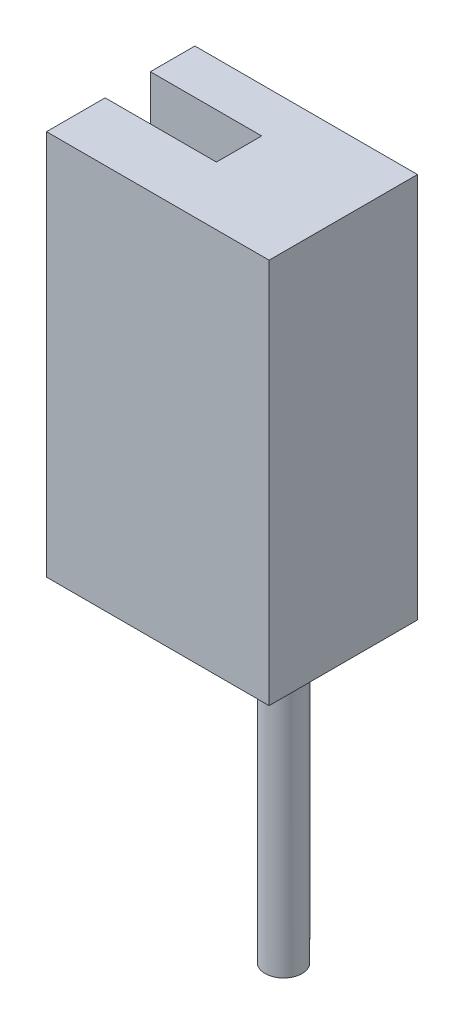
ISO-10303-21;
HEADER;
FILE_DESCRIPTION(('STEP AP214'),'2;1');
FILE_NAME('part.step','',(''),(''),'','','');
FILE_SCHEMA(('AUTOMOTIVE_DESIGN { 1 0 10303 214 1 1 1 1 }'));
ENDSEC;
DATA;
#1=APPLICATION_CONTEXT('core data for automotive mechanical design processes');
#2=APPLICATION_PROTOCOL_DEFINITION('international standard','automotive_design',2000,#1);
#3=PRODUCT_CONTEXT('',#1,'mechanical');
#4=PRODUCT('Part','Part','',(#3));
#5=PRODUCT_RELATED_PRODUCT_CATEGORY('part','',(#4));
#6=PRODUCT_DEFINITION_FORMATION('','',#4);
#7=PRODUCT_DEFINITION_CONTEXT('part definition',#1,'design');
#8=PRODUCT_DEFINITION('design','',#6,#7);
#9=PRODUCT_DEFINITION_SHAPE('','',#8);
#10=(LENGTH_UNIT() NAMED_UNIT(*) SI_UNIT(.MILLI.,.METRE.));
#11=(NAMED_UNIT(*) PLANE_ANGLE_UNIT() SI_UNIT($,.RADIAN.));
#12=(NAMED_UNIT(*) SI_UNIT($,.STERADIAN.) SOLID_ANGLE_UNIT());
#13=UNCERTAINTY_MEASURE_WITH_UNIT(LENGTH_MEASURE(1.E-05),#10,'distance_accuracy_value','');
#14=(GEOMETRIC_REPRESENTATION_CONTEXT(3) GLOBAL_UNCERTAINTY_ASSIGNED_CONTEXT((#13)) GLOBAL_UNIT_ASSIGNED_CONTEXT((#10,
#11,#12)) REPRESENTATION_CONTEXT('',''));
#15=CARTESIAN_POINT('',(0.,0.,0.));
#16=DIRECTION('',(0.,0.,1.));
#17=DIRECTION('',(1.,0.,0.));
#18=AXIS2_PLACEMENT_3D('',#15,#16,#17);
#19=CARTESIAN_POINT('',(10.5140373189169,0.,20.));
#20=DIRECTION('',(1.,0.,0.));
#21=DIRECTION('',(0.,1.,0.));
#22=AXIS2_PLACEMENT_3D('',#19,#20,#21);
#23=PLANE('',#22);
#24=DIRECTION('',(0.,0.,-1.));
#25=VECTOR('',#24,1.);
#26=CARTESIAN_POINT('',(10.5140373189169,-52.,20.));
#27=LINE('',#26,#25);
#28=CARTESIAN_POINT('',(10.5140373189169,-52.,6.));
#29=VERTEX_POINT('',#28);
#30=CARTESIAN_POINT('',(10.5140373189169,-52.,0.));
#31=VERTEX_POINT('',#30);
#32=EDGE_CURVE('E134',#29,#31,#27,.T.);
#33=ORIENTED_EDGE('',*,*,#32,.F.);
#34=DIRECTION('',(0.,1.,0.));
#35=VECTOR('',#34,1.);
#36=CARTESIAN_POINT('',(10.5140373189169,-52.,6.));
#37=LINE('',#36,#35);
#38=CARTESIAN_POINT('',(10.5140373189169,0.,6.));
#39=VERTEX_POINT('',#38);
#40=EDGE_CURVE('E152',#29,#39,#37,.T.);
#41=ORIENTED_EDGE('',*,*,#40,.T.);
#42=DIRECTION('',(0.,0.,-1.));
#43=VECTOR('',#42,1.);
#44=CARTESIAN_POINT('',(10.5140373189169,0.,20.));
#45=LINE('',#44,#43);
#46=CARTESIAN_POINT('',(10.5140373189169,0.,0.));
#47=VERTEX_POINT('',#46);
#48=EDGE_CURVE('E133',#39,#47,#45,.T.);
#49=ORIENTED_EDGE('',*,*,#48,.T.);
#50=DIRECTION('',(0.,-1.,0.));
#51=VECTOR('',#50,1.);
#52=CARTESIAN_POINT('',(10.5140373189169,0.,0.));
#53=LINE('',#52,#51);
#54=EDGE_CURVE('E154',#47,#31,#53,.T.);
#55=ORIENTED_EDGE('',*,*,#54,.T.);
#56=EDGE_LOOP('',(#33,#41,#49,#55));
#57=FACE_BOUND('',#56,.T.);
#58=ADVANCED_FACE('F40',(#57),#23,.F.);
#59=CARTESIAN_POINT('',(40.5140373189169,0.,20.));
#60=DIRECTION('',(-1.,0.,0.));
#61=DIRECTION('',(0.,-1.,0.));
#62=AXIS2_PLACEMENT_3D('',#59,#60,#61);
#63=PLANE('',#62);
#64=DIRECTION('',(0.,1.,0.));
#65=VECTOR('',#64,1.);
#66=CARTESIAN_POINT('',(40.5140373189169,0.,0.));
#67=LINE('',#66,#65);
#68=CARTESIAN_POINT('',(40.5140373189169,-52.,0.));
#69=VERTEX_POINT('',#68);
#70=CARTESIAN_POINT('',(40.5140373189169,0.,0.));
#71=VERTEX_POINT('',#70);
#72=EDGE_CURVE('E150',#69,#71,#67,.T.);
#73=ORIENTED_EDGE('',*,*,#72,.T.);
#74=DIRECTION('',(0.,0.,-1.));
#75=VECTOR('',#74,1.);
#76=CARTESIAN_POINT('',(40.5140373189169,0.,20.));
#77=LINE('',#76,#75);
#78=CARTESIAN_POINT('',(40.5140373189169,0.,20.));
#79=VERTEX_POINT('',#78);
#80=EDGE_CURVE('E48',#79,#71,#77,.T.);
#81=ORIENTED_EDGE('',*,*,#80,.F.);
#82=DIRECTION('',(0.,1.,0.));
#83=VECTOR('',#82,1.);
#84=CARTESIAN_POINT('',(40.5140373189169,0.,20.));
#85=LINE('',#84,#83);
#86=CARTESIAN_POINT('',(40.5140373189169,-52.,20.));
#87=VERTEX_POINT('',#86);
#88=EDGE_CURVE('E163',#87,#79,#85,.T.);
#89=ORIENTED_EDGE('',*,*,#88,.F.);
#90=DIRECTION('',(0.,0.,-1.));
#91=VECTOR('',#90,1.);
#92=CARTESIAN_POINT('',(40.5140373189169,-52.,20.));
#93=LINE('',#92,#91);
#94=EDGE_CURVE('E137',#87,#69,#93,.T.);
#95=ORIENTED_EDGE('',*,*,#94,.T.);
#96=EDGE_LOOP('',(#73,#81,#89,#95));
#97=FACE_BOUND('',#96,.T.);
#98=ADVANCED_FACE('F42',(#97),#63,.F.);
#99=CARTESIAN_POINT('',(40.5140373189169,0.,20.));
#100=DIRECTION('',(0.,-1.,0.));
#101=DIRECTION('',(1.,0.,0.));
#102=AXIS2_PLACEMENT_3D('',#99,#100,#101);
#103=PLANE('',#102);
#104=ORIENTED_EDGE('',*,*,#48,.F.);
#105=DIRECTION('',(-1.,0.,0.));
#106=VECTOR('',#105,1.);
#107=CARTESIAN_POINT('',(10.5140373189169,0.,6.));
#108=LINE('',#107,#106);
#109=CARTESIAN_POINT('',(25.5140373189169,0.,6.));
#110=VERTEX_POINT('',#109);
#111=EDGE_CURVE('E121',#110,#39,#108,.T.);
#112=ORIENTED_EDGE('',*,*,#111,.F.);
#113=DIRECTION('',(0.,0.,-1.));
#114=VECTOR('',#113,1.);
#115=CARTESIAN_POINT('',(25.5140373189169,0.,6.));
#116=LINE('',#115,#114);
#117=CARTESIAN_POINT('',(25.5140373189169,0.,12.1));
#118=VERTEX_POINT('',#117);
#119=EDGE_CURVE('E173',#118,#110,#116,.T.);
#120=ORIENTED_EDGE('',*,*,#119,.F.);
#121=DIRECTION('',(1.,0.,0.));
#122=VECTOR('',#121,1.);
#123=CARTESIAN_POINT('',(10.5140373189169,0.,12.1));
#124=LINE('',#123,#122);
#125=CARTESIAN_POINT('',(10.5140373189169,0.,12.1));
#126=VERTEX_POINT('',#125);
#127=EDGE_CURVE('E170',#126,#118,#124,.T.);
#128=ORIENTED_EDGE('',*,*,#127,.F.);
#129=CARTESIAN_POINT('',(10.5140373189169,0.,20.));
#130=VERTEX_POINT('',#129);
#131=EDGE_CURVE('E129',#130,#126,#45,.T.);
#132=ORIENTED_EDGE('',*,*,#131,.F.);
#133=DIRECTION('',(-1.,0.,0.));
#134=VECTOR('',#133,1.);
#135=CARTESIAN_POINT('',(40.5140373189169,0.,20.));
#136=LINE('',#135,#134);
#137=EDGE_CURVE('E92',#79,#130,#136,.T.);
#138=ORIENTED_EDGE('',*,*,#137,.F.);
#139=ORIENTED_EDGE('',*,*,#80,.T.);
#140=DIRECTION('',(-1.,0.,0.));
#141=VECTOR('',#140,1.);
#142=CARTESIAN_POINT('',(40.5140373189169,0.,0.));
#143=LINE('',#142,#141);
#144=EDGE_CURVE('E145',#71,#47,#143,.T.);
#145=ORIENTED_EDGE('',*,*,#144,.T.);
#146=EDGE_LOOP('',(#104,#112,#120,#128,#132,#138,#139,#145));
#147=FACE_BOUND('',#146,.T.);
#148=ADVANCED_FACE('F144',(#147),#103,.F.);
#149=ORIENTED_EDGE('',*,*,#131,.T.);
#150=DIRECTION('',(0.,1.,0.));
#151=VECTOR('',#150,1.);
#152=CARTESIAN_POINT('',(10.5140373189169,-52.,12.1));
#153=LINE('',#152,#151);
#154=CARTESIAN_POINT('',(10.5140373189169,-52.,12.1));
#155=VERTEX_POINT('',#154);
#156=EDGE_CURVE('E117',#155,#126,#153,.T.);
#157=ORIENTED_EDGE('',*,*,#156,.F.);
#158=CARTESIAN_POINT('',(10.5140373189169,-52.,20.));
#159=VERTEX_POINT('',#158);
#160=EDGE_CURVE('E128',#159,#155,#27,.T.);
#161=ORIENTED_EDGE('',*,*,#160,.F.);
#162=DIRECTION('',(0.,-1.,0.));
#163=VECTOR('',#162,1.);
#164=CARTESIAN_POINT('',(10.5140373189169,0.,20.));
#165=LINE('',#164,#163);
#166=EDGE_CURVE('E165',#130,#159,#165,.T.);
#167=ORIENTED_EDGE('',*,*,#166,.F.);
#168=EDGE_LOOP('',(#149,#157,#161,#167));
#169=FACE_BOUND('',#168,.T.);
#170=ADVANCED_FACE('F126',(#169),#23,.F.);
#171=CARTESIAN_POINT('',(40.5140373189169,-52.,20.));
#172=DIRECTION('',(0.,1.,0.));
#173=DIRECTION('',(-1.,0.,0.));
#174=AXIS2_PLACEMENT_3D('',#171,#172,#173);
#175=PLANE('',#174);
#176=CARTESIAN_POINT('',(31.5140373189169,-52.,9.05));
#177=DIRECTION('',(0.,1.,0.));
#178=DIRECTION('',(-1.,0.,0.));
#179=AXIS2_PLACEMENT_3D('',#176,#177,#178);
#180=CIRCLE('',#179,2.5);
#181=CARTESIAN_POINT('',(29.0140373189169,-52.,9.05));
#182=VERTEX_POINT('',#181);
#183=EDGE_CURVE('E11',#182,#182,#180,.F.);
#184=ORIENTED_EDGE('',*,*,#183,.F.);
#185=EDGE_LOOP('',(#184));
#186=FACE_BOUND('',#185,.T.);
#187=DIRECTION('',(0.,0.,-1.));
#188=VECTOR('',#187,1.);
#189=CARTESIAN_POINT('',(25.5140373189169,-52.,6.));
#190=LINE('',#189,#188);
#191=CARTESIAN_POINT('',(25.5140373189169,-52.,12.1));
#192=VERTEX_POINT('',#191);
#193=CARTESIAN_POINT('',(25.5140373189169,-52.,6.));
#194=VERTEX_POINT('',#193);
#195=EDGE_CURVE('E55',#192,#194,#190,.T.);
#196=ORIENTED_EDGE('',*,*,#195,.T.);
#197=DIRECTION('',(-1.,0.,0.));
#198=VECTOR('',#197,1.);
#199=CARTESIAN_POINT('',(10.5140373189169,-52.,6.));
#200=LINE('',#199,#198);
#201=EDGE_CURVE('E130',#194,#29,#200,.T.);
#202=ORIENTED_EDGE('',*,*,#201,.T.);
#203=ORIENTED_EDGE('',*,*,#32,.T.);
#204=DIRECTION('',(1.,0.,0.));
#205=VECTOR('',#204,1.);
#206=CARTESIAN_POINT('',(40.5140373189169,-52.,0.));
#207=LINE('',#206,#205);
#208=EDGE_CURVE('E84',#31,#69,#207,.T.);
#209=ORIENTED_EDGE('',*,*,#208,.T.);
#210=ORIENTED_EDGE('',*,*,#94,.F.);
#211=DIRECTION('',(1.,0.,0.));
#212=VECTOR('',#211,1.);
#213=CARTESIAN_POINT('',(40.5140373189169,-52.,20.));
#214=LINE('',#213,#212);
#215=EDGE_CURVE('E64',#159,#87,#214,.T.);
#216=ORIENTED_EDGE('',*,*,#215,.F.);
#217=ORIENTED_EDGE('',*,*,#160,.T.);
#218=DIRECTION('',(1.,0.,0.));
#219=VECTOR('',#218,1.);
#220=CARTESIAN_POINT('',(10.5140373189169,-52.,12.1));
#221=LINE('',#220,#219);
#222=EDGE_CURVE('E113',#155,#192,#221,.T.);
#223=ORIENTED_EDGE('',*,*,#222,.T.);
#224=EDGE_LOOP('',(#196,#202,#203,#209,#210,#216,#217,#223));
#225=FACE_BOUND('',#224,.T.);
#226=ADVANCED_FACE('F132',(#186,#225),#175,.F.);
#227=CARTESIAN_POINT('',(0.,0.,20.));
#228=DIRECTION('',(0.,0.,-1.));
#229=DIRECTION('',(-1.,0.,0.));
#230=AXIS2_PLACEMENT_3D('',#227,#228,#229);
#231=PLANE('',#230);
#232=ORIENTED_EDGE('',*,*,#88,.T.);
#233=ORIENTED_EDGE('',*,*,#137,.T.);
#234=ORIENTED_EDGE('',*,*,#166,.T.);
#235=ORIENTED_EDGE('',*,*,#215,.T.);
#236=EDGE_LOOP('',(#232,#233,#234,#235));
#237=FACE_BOUND('',#236,.T.);
#238=ADVANCED_FACE('F168',(#237),#231,.F.);
#239=CARTESIAN_POINT('',(0.,0.,0.));
#240=DIRECTION('',(0.,0.,-1.));
#241=DIRECTION('',(-1.,0.,0.));
#242=AXIS2_PLACEMENT_3D('',#239,#240,#241);
#243=PLANE('',#242);
#244=ORIENTED_EDGE('',*,*,#72,.F.);
#245=ORIENTED_EDGE('',*,*,#208,.F.);
#246=ORIENTED_EDGE('',*,*,#54,.F.);
#247=ORIENTED_EDGE('',*,*,#144,.F.);
#248=EDGE_LOOP('',(#244,#245,#246,#247));
#249=FACE_BOUND('',#248,.T.);
#250=ADVANCED_FACE('F190',(#249),#243,.T.);
#251=CARTESIAN_POINT('',(10.5140373189169,-52.,6.));
#252=DIRECTION('',(0.,0.,-1.));
#253=DIRECTION('',(-1.,0.,0.));
#254=AXIS2_PLACEMENT_3D('',#251,#252,#253);
#255=PLANE('',#254);
#256=ORIENTED_EDGE('',*,*,#111,.T.);
#257=ORIENTED_EDGE('',*,*,#40,.F.);
#258=ORIENTED_EDGE('',*,*,#201,.F.);
#259=DIRECTION('',(0.,1.,0.));
#260=VECTOR('',#259,1.);
#261=CARTESIAN_POINT('',(25.5140373189169,-52.,6.));
#262=LINE('',#261,#260);
#263=EDGE_CURVE('E157',#194,#110,#262,.T.);
#264=ORIENTED_EDGE('',*,*,#263,.T.);
#265=EDGE_LOOP('',(#256,#257,#258,#264));
#266=FACE_BOUND('',#265,.T.);
#267=ADVANCED_FACE('F186',(#266),#255,.F.);
#268=CARTESIAN_POINT('',(25.5140373189169,-52.,6.));
#269=DIRECTION('',(1.,0.,0.));
#270=DIRECTION('',(0.,1.,0.));
#271=AXIS2_PLACEMENT_3D('',#268,#269,#270);
#272=PLANE('',#271);
#273=ORIENTED_EDGE('',*,*,#119,.T.);
#274=ORIENTED_EDGE('',*,*,#263,.F.);
#275=ORIENTED_EDGE('',*,*,#195,.F.);
#276=DIRECTION('',(0.,1.,0.));
#277=VECTOR('',#276,1.);
#278=CARTESIAN_POINT('',(25.5140373189169,-52.,12.1));
#279=LINE('',#278,#277);
#280=EDGE_CURVE('E119',#192,#118,#279,.T.);
#281=ORIENTED_EDGE('',*,*,#280,.T.);
#282=EDGE_LOOP('',(#273,#274,#275,#281));
#283=FACE_BOUND('',#282,.T.);
#284=ADVANCED_FACE('F183',(#283),#272,.F.);
#285=CARTESIAN_POINT('',(10.5140373189169,-52.,12.1));
#286=DIRECTION('',(0.,0.,1.));
#287=DIRECTION('',(1.,0.,0.));
#288=AXIS2_PLACEMENT_3D('',#285,#286,#287);
#289=PLANE('',#288);
#290=ORIENTED_EDGE('',*,*,#127,.T.);
#291=ORIENTED_EDGE('',*,*,#280,.F.);
#292=ORIENTED_EDGE('',*,*,#222,.F.);
#293=ORIENTED_EDGE('',*,*,#156,.T.);
#294=EDGE_LOOP('',(#290,#291,#292,#293));
#295=FACE_BOUND('',#294,.T.);
#296=ADVANCED_FACE('F116',(#295),#289,.F.);
#297=CARTESIAN_POINT('',(31.5140373189169,-92.,9.05));
#298=DIRECTION('',(0.,1.,0.));
#299=DIRECTION('',(-1.,0.,0.));
#300=AXIS2_PLACEMENT_3D('',#297,#298,#299);
#301=CYLINDRICAL_SURFACE('',#300,2.5);
#302=CARTESIAN_POINT('',(31.5140373189169,-92.,9.05));
#303=DIRECTION('',(0.,-1.,0.));
#304=DIRECTION('',(1.,0.,0.));
#305=AXIS2_PLACEMENT_3D('',#302,#303,#304);
#306=CIRCLE('',#305,2.5);
#307=CARTESIAN_POINT('',(34.0140373189169,-92.,9.05));
#308=VERTEX_POINT('',#307);
#309=EDGE_CURVE('E174',#308,#308,#306,.T.);
#310=ORIENTED_EDGE('',*,*,#309,.F.);
#311=EDGE_LOOP('',(#310));
#312=FACE_BOUND('',#311,.T.);
#313=ORIENTED_EDGE('',*,*,#183,.T.);
#314=EDGE_LOOP('',(#313));
#315=FACE_BOUND('',#314,.T.);
#316=ADVANCED_FACE('F254',(#312,#315),#301,.T.);
#317=CARTESIAN_POINT('',(31.5140373189169,-92.,9.05));
#318=DIRECTION('',(0.,-1.,0.));
#319=DIRECTION('',(1.,0.,0.));
#320=AXIS2_PLACEMENT_3D('',#317,#318,#319);
#321=PLANE('',#320);
#322=ORIENTED_EDGE('',*,*,#309,.T.);
#323=EDGE_LOOP('',(#322));
#324=FACE_BOUND('',#323,.T.);
#325=ADVANCED_FACE('F263',(#324),#321,.T.);
#326=CLOSED_SHELL('',(#58,#98,#148,#170,#226,#238,#250,#267,#284,#296,#316,#325));
#327=MANIFOLD_SOLID_BREP('B2',#326);
#328=ADVANCED_BREP_SHAPE_REPRESENTATION('',(#18,#327),#14);
#329=SHAPE_DEFINITION_REPRESENTATION(#9,#328);
ENDSEC;
END-ISO-10303-21;
